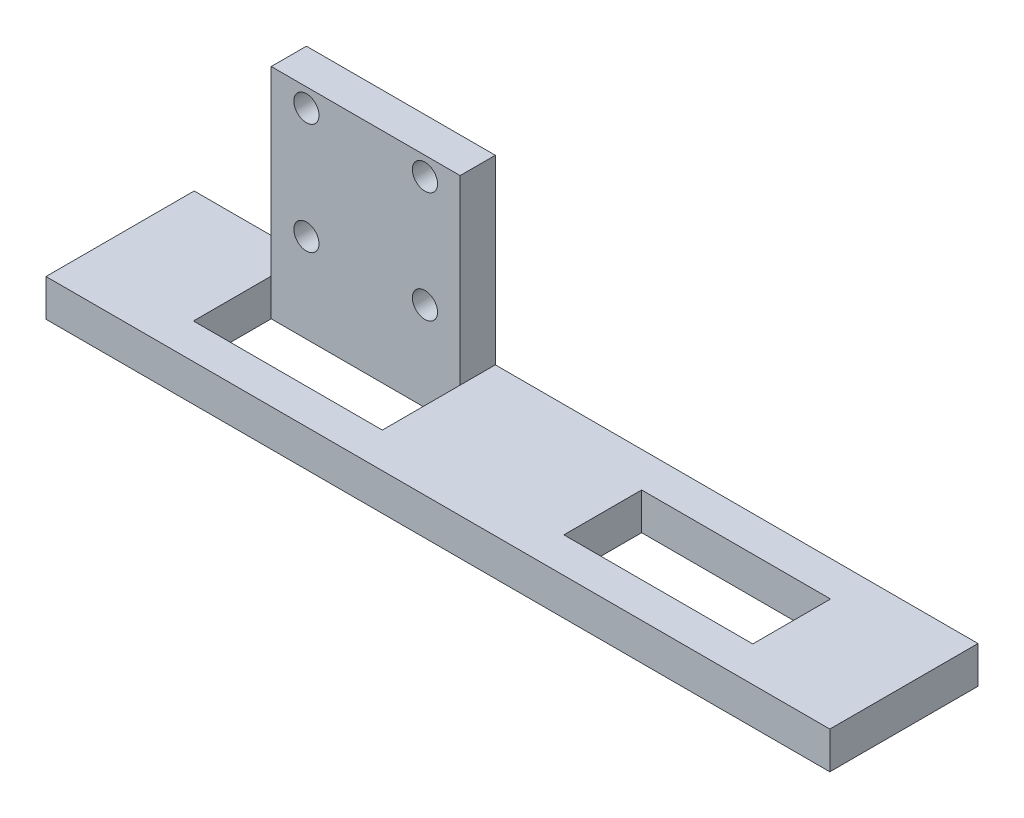
ISO-10303-21;
HEADER;
FILE_DESCRIPTION(('STEP AP214'),'2;1');
FILE_NAME('part.step','',(''),(''),'','','');
FILE_SCHEMA(('AUTOMOTIVE_DESIGN { 1 0 10303 214 1 1 1 1 }'));
ENDSEC;
DATA;
#1=APPLICATION_CONTEXT('core data for automotive mechanical design processes');
#2=APPLICATION_PROTOCOL_DEFINITION('international standard','automotive_design',2000,#1);
#3=PRODUCT_CONTEXT('',#1,'mechanical');
#4=PRODUCT('Part','Part','',(#3));
#5=PRODUCT_RELATED_PRODUCT_CATEGORY('part','',(#4));
#6=PRODUCT_DEFINITION_FORMATION('','',#4);
#7=PRODUCT_DEFINITION_CONTEXT('part definition',#1,'design');
#8=PRODUCT_DEFINITION('design','',#6,#7);
#9=PRODUCT_DEFINITION_SHAPE('','',#8);
#10=(LENGTH_UNIT() NAMED_UNIT(*) SI_UNIT(.MILLI.,.METRE.));
#11=(NAMED_UNIT(*) PLANE_ANGLE_UNIT() SI_UNIT($,.RADIAN.));
#12=(NAMED_UNIT(*) SI_UNIT($,.STERADIAN.) SOLID_ANGLE_UNIT());
#13=UNCERTAINTY_MEASURE_WITH_UNIT(LENGTH_MEASURE(1.E-05),#10,'distance_accuracy_value','');
#14=(GEOMETRIC_REPRESENTATION_CONTEXT(3) GLOBAL_UNCERTAINTY_ASSIGNED_CONTEXT((#13)) GLOBAL_UNIT_ASSIGNED_CONTEXT((#10,
#11,#12)) REPRESENTATION_CONTEXT('',''));
#15=CARTESIAN_POINT('',(0.,0.,0.));
#16=DIRECTION('',(0.,0.,1.));
#17=DIRECTION('',(1.,0.,0.));
#18=AXIS2_PLACEMENT_3D('',#15,#16,#17);
#19=CARTESIAN_POINT('',(0.,5.,0.));
#20=DIRECTION('',(0.,1.,0.));
#21=DIRECTION('',(0.,0.,1.));
#22=AXIS2_PLACEMENT_3D('',#19,#20,#21);
#23=PLANE('',#22);
#24=DIRECTION('',(0.,0.,1.));
#25=VECTOR('',#24,1.);
#26=CARTESIAN_POINT('',(-37.75,5.,-5.25));
#27=LINE('',#26,#25);
#28=CARTESIAN_POINT('',(-37.75,5.,-9.99999999999999));
#29=VERTEX_POINT('',#28);
#30=CARTESIAN_POINT('',(-37.75,5.,-5.25));
#31=VERTEX_POINT('',#30);
#32=EDGE_CURVE('E53',#29,#31,#27,.T.);
#33=ORIENTED_EDGE('',*,*,#32,.F.);
#34=DIRECTION('',(-1.,0.,0.));
#35=VECTOR('',#34,1.);
#36=CARTESIAN_POINT('',(52.9,5.,-10.));
#37=LINE('',#36,#35);
#38=CARTESIAN_POINT('',(-52.9,5.,-9.99999999999999));
#39=VERTEX_POINT('',#38);
#40=EDGE_CURVE('E242',#29,#39,#37,.T.);
#41=ORIENTED_EDGE('',*,*,#40,.T.);
#42=DIRECTION('',(0.,0.,1.));
#43=VECTOR('',#42,1.);
#44=CARTESIAN_POINT('',(-52.9,5.,10.));
#45=LINE('',#44,#43);
#46=CARTESIAN_POINT('',(-52.9,5.,10.));
#47=VERTEX_POINT('',#46);
#48=EDGE_CURVE('E234',#39,#47,#45,.T.);
#49=ORIENTED_EDGE('',*,*,#48,.T.);
#50=DIRECTION('',(1.,0.,0.));
#51=VECTOR('',#50,1.);
#52=CARTESIAN_POINT('',(52.9,5.,10.));
#53=LINE('',#52,#51);
#54=CARTESIAN_POINT('',(52.9,5.,10.));
#55=VERTEX_POINT('',#54);
#56=EDGE_CURVE('E237',#47,#55,#53,.T.);
#57=ORIENTED_EDGE('',*,*,#56,.T.);
#58=DIRECTION('',(0.,0.,-1.));
#59=VECTOR('',#58,1.);
#60=CARTESIAN_POINT('',(52.9,5.,10.));
#61=LINE('',#60,#59);
#62=CARTESIAN_POINT('',(52.9,5.,-10.));
#63=VERTEX_POINT('',#62);
#64=EDGE_CURVE('E240',#55,#63,#61,.T.);
#65=ORIENTED_EDGE('',*,*,#64,.T.);
#66=CARTESIAN_POINT('',(-12.25,5.,-10.));
#67=VERTEX_POINT('',#66);
#68=EDGE_CURVE('E243',#63,#67,#37,.T.);
#69=ORIENTED_EDGE('',*,*,#68,.T.);
#70=DIRECTION('',(0.,0.,-1.));
#71=VECTOR('',#70,1.);
#72=CARTESIAN_POINT('',(-12.25,5.,-5.25));
#73=LINE('',#72,#71);
#74=CARTESIAN_POINT('',(-12.25,5.,-5.25));
#75=VERTEX_POINT('',#74);
#76=EDGE_CURVE('E168',#75,#67,#73,.T.);
#77=ORIENTED_EDGE('',*,*,#76,.F.);
#78=DIRECTION('',(0.,0.,-1.));
#79=VECTOR('',#78,1.);
#80=CARTESIAN_POINT('',(-12.25,5.,-5.25));
#81=LINE('',#80,#79);
#82=CARTESIAN_POINT('',(-12.25,5.,5.25));
#83=VERTEX_POINT('',#82);
#84=EDGE_CURVE('E185',#83,#75,#81,.T.);
#85=ORIENTED_EDGE('',*,*,#84,.F.);
#86=DIRECTION('',(1.,0.,0.));
#87=VECTOR('',#86,1.);
#88=CARTESIAN_POINT('',(-12.25,5.,5.25));
#89=LINE('',#88,#87);
#90=CARTESIAN_POINT('',(-37.75,5.,5.25));
#91=VERTEX_POINT('',#90);
#92=EDGE_CURVE('E182',#91,#83,#89,.T.);
#93=ORIENTED_EDGE('',*,*,#92,.F.);
#94=DIRECTION('',(0.,0.,1.));
#95=VECTOR('',#94,1.);
#96=CARTESIAN_POINT('',(-37.75,5.,-5.25));
#97=LINE('',#96,#95);
#98=EDGE_CURVE('E180',#31,#91,#97,.T.);
#99=ORIENTED_EDGE('',*,*,#98,.F.);
#100=EDGE_LOOP('',(#33,#41,#49,#57,#65,#69,#77,#85,#93,#99));
#101=FACE_BOUND('',#100,.T.);
#102=DIRECTION('',(-1.,0.,0.));
#103=VECTOR('',#102,1.);
#104=CARTESIAN_POINT('',(12.25,5.,-5.25));
#105=LINE('',#104,#103);
#106=CARTESIAN_POINT('',(37.75,5.,-5.25));
#107=VERTEX_POINT('',#106);
#108=CARTESIAN_POINT('',(12.25,5.,-5.25));
#109=VERTEX_POINT('',#108);
#110=EDGE_CURVE('E205',#107,#109,#105,.T.);
#111=ORIENTED_EDGE('',*,*,#110,.F.);
#112=DIRECTION('',(0.,0.,-1.));
#113=VECTOR('',#112,1.);
#114=CARTESIAN_POINT('',(37.75,5.,-5.25));
#115=LINE('',#114,#113);
#116=CARTESIAN_POINT('',(37.75,5.,5.25));
#117=VERTEX_POINT('',#116);
#118=EDGE_CURVE('E203',#117,#107,#115,.T.);
#119=ORIENTED_EDGE('',*,*,#118,.F.);
#120=DIRECTION('',(1.,0.,0.));
#121=VECTOR('',#120,1.);
#122=CARTESIAN_POINT('',(12.25,5.,5.25));
#123=LINE('',#122,#121);
#124=CARTESIAN_POINT('',(12.25,5.,5.25));
#125=VERTEX_POINT('',#124);
#126=EDGE_CURVE('E211',#125,#117,#123,.T.);
#127=ORIENTED_EDGE('',*,*,#126,.F.);
#128=DIRECTION('',(0.,0.,1.));
#129=VECTOR('',#128,1.);
#130=CARTESIAN_POINT('',(12.25,5.,-5.25));
#131=LINE('',#130,#129);
#132=EDGE_CURVE('E208',#109,#125,#131,.T.);
#133=ORIENTED_EDGE('',*,*,#132,.F.);
#134=EDGE_LOOP('',(#111,#119,#127,#133));
#135=FACE_BOUND('',#134,.T.);
#136=ADVANCED_FACE('F36',(#101,#135),#23,.T.);
#137=CARTESIAN_POINT('',(0.,0.,0.));
#138=DIRECTION('',(0.,1.,0.));
#139=DIRECTION('',(0.,0.,1.));
#140=AXIS2_PLACEMENT_3D('',#137,#138,#139);
#141=PLANE('',#140);
#142=DIRECTION('',(0.,0.,-1.));
#143=VECTOR('',#142,1.);
#144=CARTESIAN_POINT('',(37.75,0.,-5.25));
#145=LINE('',#144,#143);
#146=CARTESIAN_POINT('',(37.75,0.,5.25));
#147=VERTEX_POINT('',#146);
#148=CARTESIAN_POINT('',(37.75,0.,-5.25));
#149=VERTEX_POINT('',#148);
#150=EDGE_CURVE('E202',#147,#149,#145,.T.);
#151=ORIENTED_EDGE('',*,*,#150,.T.);
#152=DIRECTION('',(-1.,0.,0.));
#153=VECTOR('',#152,1.);
#154=CARTESIAN_POINT('',(12.25,0.,-5.25));
#155=LINE('',#154,#153);
#156=CARTESIAN_POINT('',(12.25,0.,-5.25));
#157=VERTEX_POINT('',#156);
#158=EDGE_CURVE('E216',#149,#157,#155,.T.);
#159=ORIENTED_EDGE('',*,*,#158,.T.);
#160=DIRECTION('',(0.,0.,1.));
#161=VECTOR('',#160,1.);
#162=CARTESIAN_POINT('',(12.25,0.,-5.25));
#163=LINE('',#162,#161);
#164=CARTESIAN_POINT('',(12.25,0.,5.25));
#165=VERTEX_POINT('',#164);
#166=EDGE_CURVE('E219',#157,#165,#163,.T.);
#167=ORIENTED_EDGE('',*,*,#166,.T.);
#168=DIRECTION('',(1.,0.,0.));
#169=VECTOR('',#168,1.);
#170=CARTESIAN_POINT('',(12.25,0.,5.25));
#171=LINE('',#170,#169);
#172=EDGE_CURVE('E206',#165,#147,#171,.T.);
#173=ORIENTED_EDGE('',*,*,#172,.T.);
#174=EDGE_LOOP('',(#151,#159,#167,#173));
#175=FACE_BOUND('',#174,.T.);
#176=DIRECTION('',(0.,0.,1.));
#177=VECTOR('',#176,1.);
#178=CARTESIAN_POINT('',(-52.9,0.,10.));
#179=LINE('',#178,#177);
#180=CARTESIAN_POINT('',(-52.9,0.,-9.99999999999999));
#181=VERTEX_POINT('',#180);
#182=CARTESIAN_POINT('',(-52.9,0.,10.));
#183=VERTEX_POINT('',#182);
#184=EDGE_CURVE('E233',#181,#183,#179,.T.);
#185=ORIENTED_EDGE('',*,*,#184,.F.);
#186=DIRECTION('',(-1.,0.,0.));
#187=VECTOR('',#186,1.);
#188=CARTESIAN_POINT('',(52.9,0.,-10.));
#189=LINE('',#188,#187);
#190=CARTESIAN_POINT('',(52.9,0.,-10.));
#191=VERTEX_POINT('',#190);
#192=EDGE_CURVE('E238',#191,#181,#189,.T.);
#193=ORIENTED_EDGE('',*,*,#192,.F.);
#194=DIRECTION('',(0.,0.,-1.));
#195=VECTOR('',#194,1.);
#196=CARTESIAN_POINT('',(52.9,0.,10.));
#197=LINE('',#196,#195);
#198=CARTESIAN_POINT('',(52.9,0.,10.));
#199=VERTEX_POINT('',#198);
#200=EDGE_CURVE('E250',#199,#191,#197,.T.);
#201=ORIENTED_EDGE('',*,*,#200,.F.);
#202=DIRECTION('',(1.,0.,0.));
#203=VECTOR('',#202,1.);
#204=CARTESIAN_POINT('',(52.9,0.,10.));
#205=LINE('',#204,#203);
#206=EDGE_CURVE('E248',#183,#199,#205,.T.);
#207=ORIENTED_EDGE('',*,*,#206,.F.);
#208=EDGE_LOOP('',(#185,#193,#201,#207));
#209=FACE_BOUND('',#208,.T.);
#210=DIRECTION('',(-1.,0.,0.));
#211=VECTOR('',#210,1.);
#212=CARTESIAN_POINT('',(-12.25,0.,-5.25));
#213=LINE('',#212,#211);
#214=CARTESIAN_POINT('',(-12.25,0.,-5.25));
#215=VERTEX_POINT('',#214);
#216=CARTESIAN_POINT('',(-37.75,0.,-5.25));
#217=VERTEX_POINT('',#216);
#218=EDGE_CURVE('E171',#215,#217,#213,.T.);
#219=ORIENTED_EDGE('',*,*,#218,.T.);
#220=DIRECTION('',(0.,0.,1.));
#221=VECTOR('',#220,1.);
#222=CARTESIAN_POINT('',(-37.75,0.,-5.25));
#223=LINE('',#222,#221);
#224=CARTESIAN_POINT('',(-37.75,0.,5.25));
#225=VERTEX_POINT('',#224);
#226=EDGE_CURVE('E174',#217,#225,#223,.T.);
#227=ORIENTED_EDGE('',*,*,#226,.T.);
#228=DIRECTION('',(1.,0.,0.));
#229=VECTOR('',#228,1.);
#230=CARTESIAN_POINT('',(-12.25,0.,5.25));
#231=LINE('',#230,#229);
#232=CARTESIAN_POINT('',(-12.25,0.,5.25));
#233=VERTEX_POINT('',#232);
#234=EDGE_CURVE('E190',#225,#233,#231,.T.);
#235=ORIENTED_EDGE('',*,*,#234,.T.);
#236=DIRECTION('',(0.,0.,-1.));
#237=VECTOR('',#236,1.);
#238=CARTESIAN_POINT('',(-12.25,0.,-5.25));
#239=LINE('',#238,#237);
#240=EDGE_CURVE('E183',#233,#215,#239,.T.);
#241=ORIENTED_EDGE('',*,*,#240,.T.);
#242=EDGE_LOOP('',(#219,#227,#235,#241));
#243=FACE_BOUND('',#242,.T.);
#244=ADVANCED_FACE('F292',(#175,#209,#243),#141,.F.);
#245=CARTESIAN_POINT('',(-52.9,5.,10.));
#246=DIRECTION('',(1.,0.,0.));
#247=DIRECTION('',(0.,0.,-1.));
#248=AXIS2_PLACEMENT_3D('',#245,#246,#247);
#249=PLANE('',#248);
#250=ORIENTED_EDGE('',*,*,#184,.T.);
#251=DIRECTION('',(0.,-1.,0.));
#252=VECTOR('',#251,1.);
#253=CARTESIAN_POINT('',(-52.9,5.,10.));
#254=LINE('',#253,#252);
#255=EDGE_CURVE('E11',#47,#183,#254,.T.);
#256=ORIENTED_EDGE('',*,*,#255,.F.);
#257=ORIENTED_EDGE('',*,*,#48,.F.);
#258=DIRECTION('',(0.,-1.,0.));
#259=VECTOR('',#258,1.);
#260=CARTESIAN_POINT('',(-52.9,5.,-9.99999999999999));
#261=LINE('',#260,#259);
#262=EDGE_CURVE('E245',#39,#181,#261,.T.);
#263=ORIENTED_EDGE('',*,*,#262,.T.);
#264=EDGE_LOOP('',(#250,#256,#257,#263));
#265=FACE_BOUND('',#264,.T.);
#266=ADVANCED_FACE('F38',(#265),#249,.F.);
#267=CARTESIAN_POINT('',(52.9,5.,10.));
#268=DIRECTION('',(0.,0.,-1.));
#269=DIRECTION('',(-1.,0.,0.));
#270=AXIS2_PLACEMENT_3D('',#267,#268,#269);
#271=PLANE('',#270);
#272=ORIENTED_EDGE('',*,*,#206,.T.);
#273=DIRECTION('',(0.,-1.,0.));
#274=VECTOR('',#273,1.);
#275=CARTESIAN_POINT('',(52.9,5.,10.));
#276=LINE('',#275,#274);
#277=EDGE_CURVE('E45',#55,#199,#276,.T.);
#278=ORIENTED_EDGE('',*,*,#277,.F.);
#279=ORIENTED_EDGE('',*,*,#56,.F.);
#280=ORIENTED_EDGE('',*,*,#255,.T.);
#281=EDGE_LOOP('',(#272,#278,#279,#280));
#282=FACE_BOUND('',#281,.T.);
#283=ADVANCED_FACE('F325',(#282),#271,.F.);
#284=CARTESIAN_POINT('',(52.9,5.,10.));
#285=DIRECTION('',(-1.,0.,0.));
#286=DIRECTION('',(0.,0.,1.));
#287=AXIS2_PLACEMENT_3D('',#284,#285,#286);
#288=PLANE('',#287);
#289=ORIENTED_EDGE('',*,*,#200,.T.);
#290=DIRECTION('',(0.,-1.,0.));
#291=VECTOR('',#290,1.);
#292=CARTESIAN_POINT('',(52.9,5.,-10.));
#293=LINE('',#292,#291);
#294=EDGE_CURVE('E255',#63,#191,#293,.T.);
#295=ORIENTED_EDGE('',*,*,#294,.F.);
#296=ORIENTED_EDGE('',*,*,#64,.F.);
#297=ORIENTED_EDGE('',*,*,#277,.T.);
#298=EDGE_LOOP('',(#289,#295,#296,#297));
#299=FACE_BOUND('',#298,.T.);
#300=ADVANCED_FACE('F322',(#299),#288,.F.);
#301=CARTESIAN_POINT('',(52.9,5.,-10.));
#302=DIRECTION('',(0.,0.,1.));
#303=DIRECTION('',(1.,0.,0.));
#304=AXIS2_PLACEMENT_3D('',#301,#302,#303);
#305=PLANE('',#304);
#306=CARTESIAN_POINT('',(-17.,27.,-9.99999999999999));
#307=DIRECTION('',(0.,0.,-1.));
#308=DIRECTION('',(-1.,0.,0.));
#309=AXIS2_PLACEMENT_3D('',#306,#307,#308);
#310=CIRCLE('',#309,1.7);
#311=CARTESIAN_POINT('',(-18.7,27.,-9.99999999999999));
#312=VERTEX_POINT('',#311);
#313=EDGE_CURVE('E499',#312,#312,#310,.T.);
#314=ORIENTED_EDGE('',*,*,#313,.F.);
#315=EDGE_LOOP('',(#314));
#316=FACE_BOUND('',#315,.T.);
#317=CARTESIAN_POINT('',(-17.,12.,-9.99999999999999));
#318=DIRECTION('',(0.,0.,-1.));
#319=DIRECTION('',(-1.,0.,0.));
#320=AXIS2_PLACEMENT_3D('',#317,#318,#319);
#321=CIRCLE('',#320,1.7);
#322=CARTESIAN_POINT('',(-18.7,12.,-9.99999999999999));
#323=VERTEX_POINT('',#322);
#324=EDGE_CURVE('E500',#323,#323,#321,.T.);
#325=ORIENTED_EDGE('',*,*,#324,.F.);
#326=EDGE_LOOP('',(#325));
#327=FACE_BOUND('',#326,.T.);
#328=CARTESIAN_POINT('',(-33.,12.,-9.99999999999999));
#329=DIRECTION('',(0.,0.,-1.));
#330=DIRECTION('',(-1.,0.,0.));
#331=AXIS2_PLACEMENT_3D('',#328,#329,#330);
#332=CIRCLE('',#331,1.7);
#333=CARTESIAN_POINT('',(-34.7,12.,-9.99999999999999));
#334=VERTEX_POINT('',#333);
#335=EDGE_CURVE('E503',#334,#334,#332,.T.);
#336=ORIENTED_EDGE('',*,*,#335,.F.);
#337=EDGE_LOOP('',(#336));
#338=FACE_BOUND('',#337,.T.);
#339=CARTESIAN_POINT('',(-33.,27.,-9.99999999999999));
#340=DIRECTION('',(0.,0.,-1.));
#341=DIRECTION('',(-1.,0.,0.));
#342=AXIS2_PLACEMENT_3D('',#339,#340,#341);
#343=CIRCLE('',#342,1.7);
#344=CARTESIAN_POINT('',(-34.7,27.,-9.99999999999999));
#345=VERTEX_POINT('',#344);
#346=EDGE_CURVE('E264',#345,#345,#343,.T.);
#347=ORIENTED_EDGE('',*,*,#346,.F.);
#348=EDGE_LOOP('',(#347));
#349=FACE_BOUND('',#348,.T.);
#350=ORIENTED_EDGE('',*,*,#192,.T.);
#351=ORIENTED_EDGE('',*,*,#262,.F.);
#352=ORIENTED_EDGE('',*,*,#40,.F.);
#353=DIRECTION('',(0.,-1.,0.));
#354=VECTOR('',#353,1.);
#355=CARTESIAN_POINT('',(-37.75,29.5,-9.99999999999999));
#356=LINE('',#355,#354);
#357=CARTESIAN_POINT('',(-37.75,29.5,-9.99999999999999));
#358=VERTEX_POINT('',#357);
#359=EDGE_CURVE('E279',#358,#29,#356,.T.);
#360=ORIENTED_EDGE('',*,*,#359,.F.);
#361=DIRECTION('',(-1.,0.,0.));
#362=VECTOR('',#361,1.);
#363=CARTESIAN_POINT('',(-37.75,29.5,-9.99999999999999));
#364=LINE('',#363,#362);
#365=CARTESIAN_POINT('',(-12.25,29.5,-10.));
#366=VERTEX_POINT('',#365);
#367=EDGE_CURVE('E164',#366,#358,#364,.T.);
#368=ORIENTED_EDGE('',*,*,#367,.F.);
#369=DIRECTION('',(0.,-1.,0.));
#370=VECTOR('',#369,1.);
#371=CARTESIAN_POINT('',(-12.25,29.5,-10.));
#372=LINE('',#371,#370);
#373=EDGE_CURVE('E176',#366,#67,#372,.T.);
#374=ORIENTED_EDGE('',*,*,#373,.T.);
#375=ORIENTED_EDGE('',*,*,#68,.F.);
#376=ORIENTED_EDGE('',*,*,#294,.T.);
#377=EDGE_LOOP('',(#350,#351,#352,#360,#368,#374,#375,#376));
#378=FACE_BOUND('',#377,.T.);
#379=ADVANCED_FACE('F284',(#316,#327,#338,#349,#378),#305,.F.);
#380=CARTESIAN_POINT('',(37.75,5.,-5.25));
#381=DIRECTION('',(-1.,0.,0.));
#382=DIRECTION('',(0.,0.,1.));
#383=AXIS2_PLACEMENT_3D('',#380,#381,#382);
#384=PLANE('',#383);
#385=ORIENTED_EDGE('',*,*,#150,.F.);
#386=DIRECTION('',(0.,-1.,0.));
#387=VECTOR('',#386,1.);
#388=CARTESIAN_POINT('',(37.75,5.,5.25));
#389=LINE('',#388,#387);
#390=EDGE_CURVE('E213',#117,#147,#389,.T.);
#391=ORIENTED_EDGE('',*,*,#390,.F.);
#392=ORIENTED_EDGE('',*,*,#118,.T.);
#393=DIRECTION('',(0.,-1.,0.));
#394=VECTOR('',#393,1.);
#395=CARTESIAN_POINT('',(37.75,5.,-5.25));
#396=LINE('',#395,#394);
#397=EDGE_CURVE('E230',#107,#149,#396,.T.);
#398=ORIENTED_EDGE('',*,*,#397,.T.);
#399=EDGE_LOOP('',(#385,#391,#392,#398));
#400=FACE_BOUND('',#399,.T.);
#401=ADVANCED_FACE('F317',(#400),#384,.T.);
#402=CARTESIAN_POINT('',(12.25,5.,-5.25));
#403=DIRECTION('',(0.,0.,1.));
#404=DIRECTION('',(1.,0.,0.));
#405=AXIS2_PLACEMENT_3D('',#402,#403,#404);
#406=PLANE('',#405);
#407=ORIENTED_EDGE('',*,*,#158,.F.);
#408=ORIENTED_EDGE('',*,*,#397,.F.);
#409=ORIENTED_EDGE('',*,*,#110,.T.);
#410=DIRECTION('',(0.,-1.,0.));
#411=VECTOR('',#410,1.);
#412=CARTESIAN_POINT('',(12.25,5.,-5.25));
#413=LINE('',#412,#411);
#414=EDGE_CURVE('E228',#109,#157,#413,.T.);
#415=ORIENTED_EDGE('',*,*,#414,.T.);
#416=EDGE_LOOP('',(#407,#408,#409,#415));
#417=FACE_BOUND('',#416,.T.);
#418=ADVANCED_FACE('F382',(#417),#406,.T.);
#419=CARTESIAN_POINT('',(12.25,5.,-5.25));
#420=DIRECTION('',(1.,0.,0.));
#421=DIRECTION('',(0.,0.,-1.));
#422=AXIS2_PLACEMENT_3D('',#419,#420,#421);
#423=PLANE('',#422);
#424=ORIENTED_EDGE('',*,*,#166,.F.);
#425=ORIENTED_EDGE('',*,*,#414,.F.);
#426=ORIENTED_EDGE('',*,*,#132,.T.);
#427=DIRECTION('',(0.,-1.,0.));
#428=VECTOR('',#427,1.);
#429=CARTESIAN_POINT('',(12.25,5.,5.25));
#430=LINE('',#429,#428);
#431=EDGE_CURVE('E226',#125,#165,#430,.T.);
#432=ORIENTED_EDGE('',*,*,#431,.T.);
#433=EDGE_LOOP('',(#424,#425,#426,#432));
#434=FACE_BOUND('',#433,.T.);
#435=ADVANCED_FACE('F390',(#434),#423,.T.);
#436=CARTESIAN_POINT('',(12.25,5.,5.25));
#437=DIRECTION('',(0.,0.,-1.));
#438=DIRECTION('',(-1.,0.,0.));
#439=AXIS2_PLACEMENT_3D('',#436,#437,#438);
#440=PLANE('',#439);
#441=ORIENTED_EDGE('',*,*,#172,.F.);
#442=ORIENTED_EDGE('',*,*,#431,.F.);
#443=ORIENTED_EDGE('',*,*,#126,.T.);
#444=ORIENTED_EDGE('',*,*,#390,.T.);
#445=EDGE_LOOP('',(#441,#442,#443,#444));
#446=FACE_BOUND('',#445,.T.);
#447=ADVANCED_FACE('F306',(#446),#440,.T.);
#448=CARTESIAN_POINT('',(-12.25,5.,-5.25));
#449=DIRECTION('',(0.,0.,1.));
#450=DIRECTION('',(1.,0.,0.));
#451=AXIS2_PLACEMENT_3D('',#448,#449,#450);
#452=PLANE('',#451);
#453=CARTESIAN_POINT('',(-17.,27.,-5.25));
#454=DIRECTION('',(0.,0.,1.));
#455=DIRECTION('',(1.,0.,0.));
#456=AXIS2_PLACEMENT_3D('',#453,#454,#455);
#457=CIRCLE('',#456,1.7);
#458=CARTESIAN_POINT('',(-15.3,27.,-5.25));
#459=VERTEX_POINT('',#458);
#460=EDGE_CURVE('E40',#459,#459,#457,.T.);
#461=ORIENTED_EDGE('',*,*,#460,.F.);
#462=EDGE_LOOP('',(#461));
#463=FACE_BOUND('',#462,.T.);
#464=CARTESIAN_POINT('',(-17.,12.,-5.25));
#465=DIRECTION('',(0.,0.,1.));
#466=DIRECTION('',(1.,0.,0.));
#467=AXIS2_PLACEMENT_3D('',#464,#465,#466);
#468=CIRCLE('',#467,1.7);
#469=CARTESIAN_POINT('',(-15.3,12.,-5.25));
#470=VERTEX_POINT('',#469);
#471=EDGE_CURVE('E266',#470,#470,#468,.T.);
#472=ORIENTED_EDGE('',*,*,#471,.F.);
#473=EDGE_LOOP('',(#472));
#474=FACE_BOUND('',#473,.T.);
#475=CARTESIAN_POINT('',(-33.,12.,-5.25));
#476=DIRECTION('',(0.,0.,1.));
#477=DIRECTION('',(1.,0.,0.));
#478=AXIS2_PLACEMENT_3D('',#475,#476,#477);
#479=CIRCLE('',#478,1.7);
#480=CARTESIAN_POINT('',(-31.3,12.,-5.25));
#481=VERTEX_POINT('',#480);
#482=EDGE_CURVE('E263',#481,#481,#479,.T.);
#483=ORIENTED_EDGE('',*,*,#482,.F.);
#484=EDGE_LOOP('',(#483));
#485=FACE_BOUND('',#484,.T.);
#486=CARTESIAN_POINT('',(-33.,27.,-5.25));
#487=DIRECTION('',(0.,0.,1.));
#488=DIRECTION('',(1.,0.,0.));
#489=AXIS2_PLACEMENT_3D('',#486,#487,#488);
#490=CIRCLE('',#489,1.7);
#491=CARTESIAN_POINT('',(-31.3,27.,-5.25));
#492=VERTEX_POINT('',#491);
#493=EDGE_CURVE('E260',#492,#492,#490,.T.);
#494=ORIENTED_EDGE('',*,*,#493,.F.);
#495=EDGE_LOOP('',(#494));
#496=FACE_BOUND('',#495,.T.);
#497=ORIENTED_EDGE('',*,*,#218,.F.);
#498=DIRECTION('',(0.,-1.,0.));
#499=VECTOR('',#498,1.);
#500=CARTESIAN_POINT('',(-12.25,5.,-5.25));
#501=LINE('',#500,#499);
#502=EDGE_CURVE('E186',#75,#215,#501,.T.);
#503=ORIENTED_EDGE('',*,*,#502,.F.);
#504=DIRECTION('',(0.,-1.,0.));
#505=VECTOR('',#504,1.);
#506=CARTESIAN_POINT('',(-12.25,29.5,-5.25));
#507=LINE('',#506,#505);
#508=CARTESIAN_POINT('',(-12.25,29.5,-5.25));
#509=VERTEX_POINT('',#508);
#510=EDGE_CURVE('E155',#509,#75,#507,.T.);
#511=ORIENTED_EDGE('',*,*,#510,.F.);
#512=DIRECTION('',(1.,0.,0.));
#513=VECTOR('',#512,1.);
#514=CARTESIAN_POINT('',(-37.75,29.5,-5.25));
#515=LINE('',#514,#513);
#516=CARTESIAN_POINT('',(-37.75,29.5,-5.25));
#517=VERTEX_POINT('',#516);
#518=EDGE_CURVE('E147',#517,#509,#515,.T.);
#519=ORIENTED_EDGE('',*,*,#518,.F.);
#520=DIRECTION('',(0.,-1.,0.));
#521=VECTOR('',#520,1.);
#522=CARTESIAN_POINT('',(-37.75,29.5,-5.25));
#523=LINE('',#522,#521);
#524=EDGE_CURVE('E152',#517,#31,#523,.T.);
#525=ORIENTED_EDGE('',*,*,#524,.T.);
#526=DIRECTION('',(0.,-1.,0.));
#527=VECTOR('',#526,1.);
#528=CARTESIAN_POINT('',(-37.75,5.,-5.25));
#529=LINE('',#528,#527);
#530=EDGE_CURVE('E200',#31,#217,#529,.T.);
#531=ORIENTED_EDGE('',*,*,#530,.T.);
#532=EDGE_LOOP('',(#497,#503,#511,#519,#525,#531));
#533=FACE_BOUND('',#532,.T.);
#534=ADVANCED_FACE('F149',(#463,#474,#485,#496,#533),#452,.T.);
#535=CARTESIAN_POINT('',(-37.75,5.,-5.25));
#536=DIRECTION('',(1.,0.,0.));
#537=DIRECTION('',(0.,0.,-1.));
#538=AXIS2_PLACEMENT_3D('',#535,#536,#537);
#539=PLANE('',#538);
#540=ORIENTED_EDGE('',*,*,#226,.F.);
#541=ORIENTED_EDGE('',*,*,#530,.F.);
#542=ORIENTED_EDGE('',*,*,#98,.T.);
#543=DIRECTION('',(0.,-1.,0.));
#544=VECTOR('',#543,1.);
#545=CARTESIAN_POINT('',(-37.75,5.,5.25));
#546=LINE('',#545,#544);
#547=EDGE_CURVE('E198',#91,#225,#546,.T.);
#548=ORIENTED_EDGE('',*,*,#547,.T.);
#549=EDGE_LOOP('',(#540,#541,#542,#548));
#550=FACE_BOUND('',#549,.T.);
#551=ADVANCED_FACE('F298',(#550),#539,.T.);
#552=CARTESIAN_POINT('',(-12.25,5.,5.25));
#553=DIRECTION('',(0.,0.,-1.));
#554=DIRECTION('',(-1.,0.,0.));
#555=AXIS2_PLACEMENT_3D('',#552,#553,#554);
#556=PLANE('',#555);
#557=ORIENTED_EDGE('',*,*,#234,.F.);
#558=ORIENTED_EDGE('',*,*,#547,.F.);
#559=ORIENTED_EDGE('',*,*,#92,.T.);
#560=DIRECTION('',(0.,-1.,0.));
#561=VECTOR('',#560,1.);
#562=CARTESIAN_POINT('',(-12.25,5.,5.25));
#563=LINE('',#562,#561);
#564=EDGE_CURVE('E61',#83,#233,#563,.T.);
#565=ORIENTED_EDGE('',*,*,#564,.T.);
#566=EDGE_LOOP('',(#557,#558,#559,#565));
#567=FACE_BOUND('',#566,.T.);
#568=ADVANCED_FACE('F296',(#567),#556,.T.);
#569=CARTESIAN_POINT('',(-12.25,5.,-5.25));
#570=DIRECTION('',(-1.,0.,0.));
#571=DIRECTION('',(0.,0.,1.));
#572=AXIS2_PLACEMENT_3D('',#569,#570,#571);
#573=PLANE('',#572);
#574=ORIENTED_EDGE('',*,*,#240,.F.);
#575=ORIENTED_EDGE('',*,*,#564,.F.);
#576=ORIENTED_EDGE('',*,*,#84,.T.);
#577=ORIENTED_EDGE('',*,*,#502,.T.);
#578=EDGE_LOOP('',(#574,#575,#576,#577));
#579=FACE_BOUND('',#578,.T.);
#580=ADVANCED_FACE('F290',(#579),#573,.T.);
#581=CARTESIAN_POINT('',(-37.75,29.5,-5.25));
#582=DIRECTION('',(1.,0.,0.));
#583=DIRECTION('',(0.,0.,-1.));
#584=AXIS2_PLACEMENT_3D('',#581,#582,#583);
#585=PLANE('',#584);
#586=ORIENTED_EDGE('',*,*,#32,.T.);
#587=ORIENTED_EDGE('',*,*,#524,.F.);
#588=DIRECTION('',(0.,0.,1.));
#589=VECTOR('',#588,1.);
#590=CARTESIAN_POINT('',(-37.75,29.5,-5.25));
#591=LINE('',#590,#589);
#592=EDGE_CURVE('E159',#358,#517,#591,.T.);
#593=ORIENTED_EDGE('',*,*,#592,.F.);
#594=ORIENTED_EDGE('',*,*,#359,.T.);
#595=EDGE_LOOP('',(#586,#587,#593,#594));
#596=FACE_BOUND('',#595,.T.);
#597=ADVANCED_FACE('F170',(#596),#585,.F.);
#598=CARTESIAN_POINT('',(-12.25,29.5,-5.25));
#599=DIRECTION('',(-1.,0.,0.));
#600=DIRECTION('',(0.,0.,1.));
#601=AXIS2_PLACEMENT_3D('',#598,#599,#600);
#602=PLANE('',#601);
#603=ORIENTED_EDGE('',*,*,#76,.T.);
#604=ORIENTED_EDGE('',*,*,#373,.F.);
#605=DIRECTION('',(0.,0.,-1.));
#606=VECTOR('',#605,1.);
#607=CARTESIAN_POINT('',(-12.25,29.5,-5.25));
#608=LINE('',#607,#606);
#609=EDGE_CURVE('E158',#509,#366,#608,.T.);
#610=ORIENTED_EDGE('',*,*,#609,.F.);
#611=ORIENTED_EDGE('',*,*,#510,.T.);
#612=EDGE_LOOP('',(#603,#604,#610,#611));
#613=FACE_BOUND('',#612,.T.);
#614=ADVANCED_FACE('F286',(#613),#602,.F.);
#615=CARTESIAN_POINT('',(0.,29.5,0.));
#616=DIRECTION('',(0.,-1.,0.));
#617=DIRECTION('',(0.,0.,-1.));
#618=AXIS2_PLACEMENT_3D('',#615,#616,#617);
#619=PLANE('',#618);
#620=ORIENTED_EDGE('',*,*,#592,.T.);
#621=ORIENTED_EDGE('',*,*,#518,.T.);
#622=ORIENTED_EDGE('',*,*,#609,.T.);
#623=ORIENTED_EDGE('',*,*,#367,.T.);
#624=EDGE_LOOP('',(#620,#621,#622,#623));
#625=FACE_BOUND('',#624,.T.);
#626=ADVANCED_FACE('F162',(#625),#619,.F.);
#627=CARTESIAN_POINT('',(-33.,27.,-4.99999999999999));
#628=DIRECTION('',(0.,0.,-1.));
#629=DIRECTION('',(-1.,0.,0.));
#630=AXIS2_PLACEMENT_3D('',#627,#628,#629);
#631=CYLINDRICAL_SURFACE('',#630,1.7);
#632=ORIENTED_EDGE('',*,*,#493,.T.);
#633=EDGE_LOOP('',(#632));
#634=FACE_BOUND('',#633,.T.);
#635=ORIENTED_EDGE('',*,*,#346,.T.);
#636=EDGE_LOOP('',(#635));
#637=FACE_BOUND('',#636,.T.);
#638=ADVANCED_FACE('F450',(#634,#637),#631,.F.);
#639=CARTESIAN_POINT('',(-33.,12.,-4.99999999999999));
#640=DIRECTION('',(0.,0.,-1.));
#641=DIRECTION('',(-1.,0.,0.));
#642=AXIS2_PLACEMENT_3D('',#639,#640,#641);
#643=CYLINDRICAL_SURFACE('',#642,1.7);
#644=ORIENTED_EDGE('',*,*,#482,.T.);
#645=EDGE_LOOP('',(#644));
#646=FACE_BOUND('',#645,.T.);
#647=ORIENTED_EDGE('',*,*,#335,.T.);
#648=EDGE_LOOP('',(#647));
#649=FACE_BOUND('',#648,.T.);
#650=ADVANCED_FACE('F464',(#646,#649),#643,.F.);
#651=CARTESIAN_POINT('',(-17.,12.,-4.99999999999999));
#652=DIRECTION('',(0.,0.,-1.));
#653=DIRECTION('',(-1.,0.,0.));
#654=AXIS2_PLACEMENT_3D('',#651,#652,#653);
#655=CYLINDRICAL_SURFACE('',#654,1.7);
#656=ORIENTED_EDGE('',*,*,#471,.T.);
#657=EDGE_LOOP('',(#656));
#658=FACE_BOUND('',#657,.T.);
#659=ORIENTED_EDGE('',*,*,#324,.T.);
#660=EDGE_LOOP('',(#659));
#661=FACE_BOUND('',#660,.T.);
#662=ADVANCED_FACE('F474',(#658,#661),#655,.F.);
#663=CARTESIAN_POINT('',(-17.,27.,-4.99999999999999));
#664=DIRECTION('',(0.,0.,-1.));
#665=DIRECTION('',(-1.,0.,0.));
#666=AXIS2_PLACEMENT_3D('',#663,#664,#665);
#667=CYLINDRICAL_SURFACE('',#666,1.7);
#668=ORIENTED_EDGE('',*,*,#460,.T.);
#669=EDGE_LOOP('',(#668));
#670=FACE_BOUND('',#669,.T.);
#671=ORIENTED_EDGE('',*,*,#313,.T.);
#672=EDGE_LOOP('',(#671));
#673=FACE_BOUND('',#672,.T.);
#674=ADVANCED_FACE('F484',(#670,#673),#667,.F.);
#675=CLOSED_SHELL('',(#136,#244,#266,#283,#300,#379,#401,#418,#435,#447,#534,#551,#568,#580,
#597,#614,#626,#638,#650,#662,#674));
#676=MANIFOLD_SOLID_BREP('B2',#675);
#677=ADVANCED_BREP_SHAPE_REPRESENTATION('',(#18,#676),#14);
#678=SHAPE_DEFINITION_REPRESENTATION(#9,#677);
ENDSEC;
END-ISO-10303-21;
